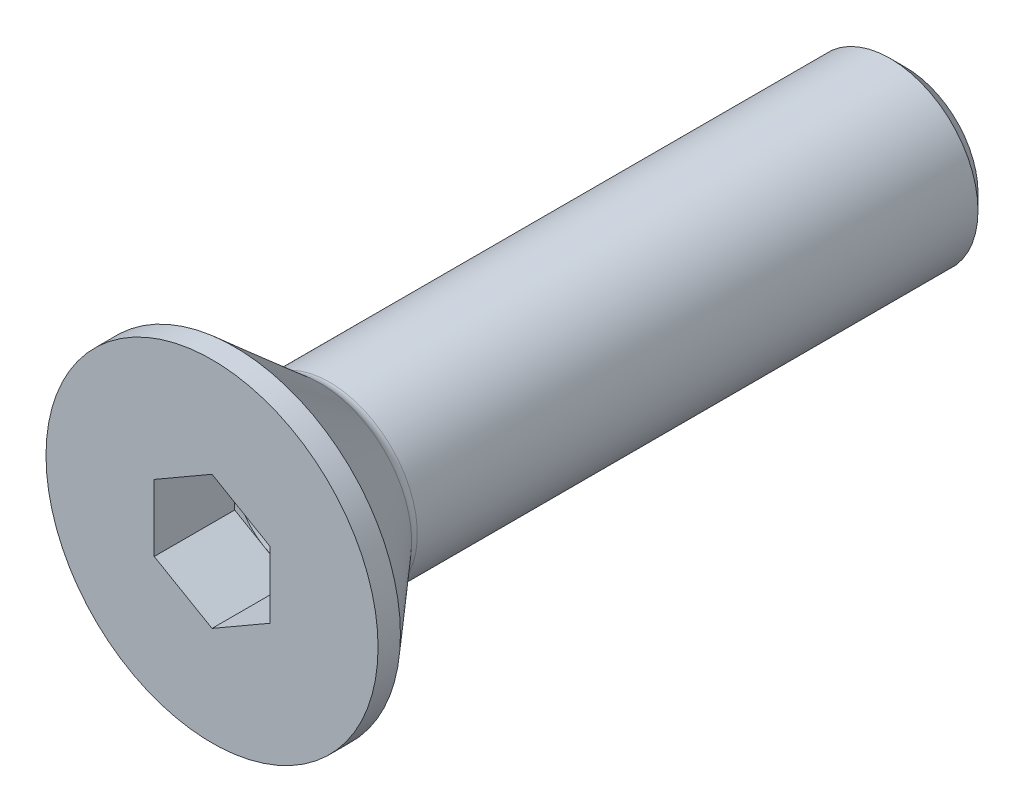
ISO-10303-21;
HEADER;
FILE_DESCRIPTION(('STEP AP214'),'2;1');
FILE_NAME('part.step','',(''),(''),'','','');
FILE_SCHEMA(('AUTOMOTIVE_DESIGN { 1 0 10303 214 1 1 1 1 }'));
ENDSEC;
DATA;
#1=APPLICATION_CONTEXT('core data for automotive mechanical design processes');
#2=APPLICATION_PROTOCOL_DEFINITION('international standard','automotive_design',2000,#1);
#3=PRODUCT_CONTEXT('',#1,'mechanical');
#4=PRODUCT('Part','Part','',(#3));
#5=PRODUCT_RELATED_PRODUCT_CATEGORY('part','',(#4));
#6=PRODUCT_DEFINITION_FORMATION('','',#4);
#7=PRODUCT_DEFINITION_CONTEXT('part definition',#1,'design');
#8=PRODUCT_DEFINITION('design','',#6,#7);
#9=PRODUCT_DEFINITION_SHAPE('','',#8);
#10=(LENGTH_UNIT() NAMED_UNIT(*) SI_UNIT(.MILLI.,.METRE.));
#11=(NAMED_UNIT(*) PLANE_ANGLE_UNIT() SI_UNIT($,.RADIAN.));
#12=(NAMED_UNIT(*) SI_UNIT($,.STERADIAN.) SOLID_ANGLE_UNIT());
#13=UNCERTAINTY_MEASURE_WITH_UNIT(LENGTH_MEASURE(1.E-05),#10,'distance_accuracy_value','');
#14=(GEOMETRIC_REPRESENTATION_CONTEXT(3) GLOBAL_UNCERTAINTY_ASSIGNED_CONTEXT((#13)) GLOBAL_UNIT_ASSIGNED_CONTEXT((#10,
#11,#12)) REPRESENTATION_CONTEXT('',''));
#15=CARTESIAN_POINT('',(0.,0.,0.));
#16=DIRECTION('',(0.,0.,1.));
#17=DIRECTION('',(1.,0.,0.));
#18=AXIS2_PLACEMENT_3D('',#15,#16,#17);
#19=CARTESIAN_POINT('',(0.,0.,-2.2098));
#20=DIRECTION('',(0.,0.,1.));
#21=DIRECTION('',(1.,0.,0.));
#22=AXIS2_PLACEMENT_3D('',#19,#20,#21);
#23=PLANE('',#22);
#24=CARTESIAN_POINT('',(0.,0.,-2.2098));
#25=DIRECTION('',(0.,0.,1.));
#26=DIRECTION('',(1.,0.,0.));
#27=AXIS2_PLACEMENT_3D('',#24,#25,#26);
#28=CIRCLE('',#27,1.5875);
#29=CARTESIAN_POINT('',(1.5875,0.,-2.2098));
#30=VERTEX_POINT('',#29);
#31=CARTESIAN_POINT('',(0.79375,1.3748153285078,-2.2098));
#32=VERTEX_POINT('',#31);
#33=EDGE_CURVE('E96',#30,#32,#28,.T.);
#34=ORIENTED_EDGE('',*,*,#33,.F.);
#35=DIRECTION('',(0.,-1.,0.));
#36=VECTOR('',#35,1.);
#37=CARTESIAN_POINT('',(1.5875,0.,-2.2098));
#38=LINE('',#37,#36);
#39=CARTESIAN_POINT('',(1.5875,0.916543552338531,-2.2098));
#40=VERTEX_POINT('',#39);
#41=EDGE_CURVE('E120',#40,#30,#38,.T.);
#42=ORIENTED_EDGE('',*,*,#41,.F.);
#43=DIRECTION('',(0.866025403784439,-0.5,0.));
#44=VECTOR('',#43,1.);
#45=CARTESIAN_POINT('',(1.82027223185862,0.782152441615088,-2.2098));
#46=LINE('',#45,#44);
#47=EDGE_CURVE('E118',#32,#40,#46,.T.);
#48=ORIENTED_EDGE('',*,*,#47,.F.);
#49=EDGE_LOOP('',(#34,#42,#48));
#50=FACE_BOUND('',#49,.T.);
#51=ADVANCED_FACE('F17',(#50),#23,.T.);
#52=CARTESIAN_POINT('',(-0.79375,1.3748153285078,-2.2098));
#53=VERTEX_POINT('',#52);
#54=EDGE_CURVE('E98',#32,#53,#28,.T.);
#55=ORIENTED_EDGE('',*,*,#54,.F.);
#56=CARTESIAN_POINT('',(0.,1.83308710467706,-2.2098));
#57=VERTEX_POINT('',#56);
#58=EDGE_CURVE('E113',#57,#32,#46,.T.);
#59=ORIENTED_EDGE('',*,*,#58,.F.);
#60=DIRECTION('',(0.866025403784438,0.5,0.));
#61=VECTOR('',#60,1.);
#62=CARTESIAN_POINT('',(-1.82027223185862,0.782152441615086,-2.2098));
#63=LINE('',#62,#61);
#64=EDGE_CURVE('E114',#53,#57,#63,.T.);
#65=ORIENTED_EDGE('',*,*,#64,.F.);
#66=EDGE_LOOP('',(#55,#59,#65));
#67=FACE_BOUND('',#66,.T.);
#68=ADVANCED_FACE('F111',(#67),#23,.T.);
#69=CARTESIAN_POINT('',(-1.5875,0.,-2.2098));
#70=VERTEX_POINT('',#69);
#71=EDGE_CURVE('E117',#53,#70,#28,.T.);
#72=ORIENTED_EDGE('',*,*,#71,.F.);
#73=CARTESIAN_POINT('',(-1.5875,0.916543552338531,-2.2098));
#74=VERTEX_POINT('',#73);
#75=EDGE_CURVE('E135',#74,#53,#63,.T.);
#76=ORIENTED_EDGE('',*,*,#75,.F.);
#77=DIRECTION('',(0.,1.,0.));
#78=VECTOR('',#77,1.);
#79=CARTESIAN_POINT('',(-1.5875,0.,-2.2098));
#80=LINE('',#79,#78);
#81=EDGE_CURVE('E139',#70,#74,#80,.T.);
#82=ORIENTED_EDGE('',*,*,#81,.F.);
#83=EDGE_LOOP('',(#72,#76,#82));
#84=FACE_BOUND('',#83,.T.);
#85=ADVANCED_FACE('F222',(#84),#23,.T.);
#86=CARTESIAN_POINT('',(-0.79375,-1.3748153285078,-2.2098));
#87=VERTEX_POINT('',#86);
#88=EDGE_CURVE('E247',#70,#87,#28,.T.);
#89=ORIENTED_EDGE('',*,*,#88,.F.);
#90=CARTESIAN_POINT('',(-1.5875,-0.91654355233853,-2.2098));
#91=VERTEX_POINT('',#90);
#92=EDGE_CURVE('E140',#91,#70,#80,.T.);
#93=ORIENTED_EDGE('',*,*,#92,.F.);
#94=DIRECTION('',(-0.866025403784439,0.5,0.));
#95=VECTOR('',#94,1.);
#96=CARTESIAN_POINT('',(0.232772231858619,-1.96747821540051,-2.2098));
#97=LINE('',#96,#95);
#98=EDGE_CURVE('E144',#87,#91,#97,.T.);
#99=ORIENTED_EDGE('',*,*,#98,.F.);
#100=EDGE_LOOP('',(#89,#93,#99));
#101=FACE_BOUND('',#100,.T.);
#102=ADVANCED_FACE('F234',(#101),#23,.T.);
#103=CARTESIAN_POINT('',(0.79375,-1.3748153285078,-2.2098));
#104=VERTEX_POINT('',#103);
#105=EDGE_CURVE('E33',#87,#104,#28,.T.);
#106=ORIENTED_EDGE('',*,*,#105,.F.);
#107=CARTESIAN_POINT('',(0.,-1.83308710467706,-2.2098));
#108=VERTEX_POINT('',#107);
#109=EDGE_CURVE('E145',#108,#87,#97,.T.);
#110=ORIENTED_EDGE('',*,*,#109,.F.);
#111=DIRECTION('',(-0.866025403784438,-0.5,0.));
#112=VECTOR('',#111,1.);
#113=CARTESIAN_POINT('',(1.82027223185862,-0.782152441615086,-2.2098));
#114=LINE('',#113,#112);
#115=EDGE_CURVE('E149',#104,#108,#114,.T.);
#116=ORIENTED_EDGE('',*,*,#115,.F.);
#117=EDGE_LOOP('',(#106,#110,#116));
#118=FACE_BOUND('',#117,.T.);
#119=ADVANCED_FACE('F227',(#118),#23,.T.);
#120=CARTESIAN_POINT('',(-2.27965,0.,0.));
#121=DIRECTION('',(0.,0.,-1.));
#122=DIRECTION('',(-1.,0.,0.));
#123=AXIS2_PLACEMENT_3D('',#120,#121,#122);
#124=PLANE('',#123);
#125=CARTESIAN_POINT('',(0.,0.,0.));
#126=DIRECTION('',(0.,0.,-1.));
#127=DIRECTION('',(-1.,0.,0.));
#128=AXIS2_PLACEMENT_3D('',#125,#126,#127);
#129=CIRCLE('',#128,4.5593);
#130=CARTESIAN_POINT('',(-4.5593,0.,0.));
#131=VERTEX_POINT('',#130);
#132=EDGE_CURVE('E204',#131,#131,#129,.T.);
#133=ORIENTED_EDGE('',*,*,#132,.F.);
#134=EDGE_LOOP('',(#133));
#135=FACE_BOUND('',#134,.T.);
#136=DIRECTION('',(0.866025403784439,-0.5,0.));
#137=VECTOR('',#136,1.);
#138=CARTESIAN_POINT('',(1.82027223185862,0.782152441615088,0.));
#139=LINE('',#138,#137);
#140=CARTESIAN_POINT('',(0.,1.83308710467706,0.));
#141=VERTEX_POINT('',#140);
#142=CARTESIAN_POINT('',(1.5875,0.916543552338531,0.));
#143=VERTEX_POINT('',#142);
#144=EDGE_CURVE('E106',#141,#143,#139,.T.);
#145=ORIENTED_EDGE('',*,*,#144,.T.);
#146=DIRECTION('',(0.,-1.,0.));
#147=VECTOR('',#146,1.);
#148=CARTESIAN_POINT('',(1.5875,0.,0.));
#149=LINE('',#148,#147);
#150=CARTESIAN_POINT('',(1.5875,-0.916543552338531,0.));
#151=VERTEX_POINT('',#150);
#152=EDGE_CURVE('E124',#143,#151,#149,.T.);
#153=ORIENTED_EDGE('',*,*,#152,.T.);
#154=DIRECTION('',(-0.866025403784438,-0.5,0.));
#155=VECTOR('',#154,1.);
#156=CARTESIAN_POINT('',(1.82027223185862,-0.782152441615086,0.));
#157=LINE('',#156,#155);
#158=CARTESIAN_POINT('',(0.,-1.83308710467706,0.));
#159=VERTEX_POINT('',#158);
#160=EDGE_CURVE('E41',#151,#159,#157,.T.);
#161=ORIENTED_EDGE('',*,*,#160,.T.);
#162=DIRECTION('',(-0.866025403784439,0.5,0.));
#163=VECTOR('',#162,1.);
#164=CARTESIAN_POINT('',(0.232772231858619,-1.96747821540051,0.));
#165=LINE('',#164,#163);
#166=CARTESIAN_POINT('',(-1.5875,-0.91654355233853,0.));
#167=VERTEX_POINT('',#166);
#168=EDGE_CURVE('E169',#159,#167,#165,.T.);
#169=ORIENTED_EDGE('',*,*,#168,.T.);
#170=DIRECTION('',(0.,1.,0.));
#171=VECTOR('',#170,1.);
#172=CARTESIAN_POINT('',(-1.5875,0.,0.));
#173=LINE('',#172,#171);
#174=CARTESIAN_POINT('',(-1.5875,0.916543552338531,0.));
#175=VERTEX_POINT('',#174);
#176=EDGE_CURVE('E165',#167,#175,#173,.T.);
#177=ORIENTED_EDGE('',*,*,#176,.T.);
#178=DIRECTION('',(0.866025403784438,0.5,0.));
#179=VECTOR('',#178,1.);
#180=CARTESIAN_POINT('',(-1.82027223185862,0.782152441615086,0.));
#181=LINE('',#180,#179);
#182=EDGE_CURVE('E161',#175,#141,#181,.T.);
#183=ORIENTED_EDGE('',*,*,#182,.T.);
#184=EDGE_LOOP('',(#145,#153,#161,#169,#177,#183));
#185=FACE_BOUND('',#184,.T.);
#186=ADVANCED_FACE('F233',(#135,#185),#124,.F.);
#187=CARTESIAN_POINT('',(0.,0.,3.39570524304279));
#188=DIRECTION('',(0.,0.,-1.));
#189=DIRECTION('',(-1.,0.,0.));
#190=AXIS2_PLACEMENT_3D('',#187,#188,#189);
#191=CYLINDRICAL_SURFACE('',#190,2.413);
#192=CARTESIAN_POINT('',(0.,0.,-18.62105761938));
#193=DIRECTION('',(0.,0.,1.));
#194=DIRECTION('',(1.,0.,0.));
#195=AXIS2_PLACEMENT_3D('',#192,#193,#194);
#196=CIRCLE('',#195,2.413);
#197=CARTESIAN_POINT('',(2.413,0.,-18.62105761938));
#198=VERTEX_POINT('',#197);
#199=EDGE_CURVE('E11',#198,#198,#196,.T.);
#200=ORIENTED_EDGE('',*,*,#199,.T.);
#201=EDGE_LOOP('',(#200));
#202=FACE_BOUND('',#201,.T.);
#203=CARTESIAN_POINT('',(0.,0.,-3.2258));
#204=DIRECTION('',(0.,0.,-1.));
#205=DIRECTION('',(-1.,0.,0.));
#206=AXIS2_PLACEMENT_3D('',#203,#204,#205);
#207=CIRCLE('',#206,2.413);
#208=CARTESIAN_POINT('',(-2.413,0.,-3.2258));
#209=VERTEX_POINT('',#208);
#210=EDGE_CURVE('E192',#209,#209,#207,.T.);
#211=ORIENTED_EDGE('',*,*,#210,.T.);
#212=EDGE_LOOP('',(#211));
#213=FACE_BOUND('',#212,.T.);
#214=ADVANCED_FACE('F239',(#202,#213),#191,.T.);
#215=CARTESIAN_POINT('',(-1.2065,0.,-19.05));
#216=DIRECTION('',(0.,0.,1.));
#217=DIRECTION('',(1.,0.,0.));
#218=AXIS2_PLACEMENT_3D('',#215,#216,#217);
#219=PLANE('',#218);
#220=CARTESIAN_POINT('',(0.,0.,-19.05));
#221=DIRECTION('',(0.,0.,1.));
#222=DIRECTION('',(1.,0.,0.));
#223=AXIS2_PLACEMENT_3D('',#220,#221,#222);
#224=CIRCLE('',#223,1.98405761938);
#225=CARTESIAN_POINT('',(1.98405761938,0.,-19.05));
#226=VERTEX_POINT('',#225);
#227=EDGE_CURVE('E26',#226,#226,#224,.F.);
#228=ORIENTED_EDGE('',*,*,#227,.T.);
#229=EDGE_LOOP('',(#228));
#230=FACE_BOUND('',#229,.T.);
#231=ADVANCED_FACE('F211',(#230),#219,.F.);
#232=CARTESIAN_POINT('',(0.,0.,3.39570524304279));
#233=DIRECTION('',(0.,0.,-1.));
#234=DIRECTION('',(-1.,0.,0.));
#235=AXIS2_PLACEMENT_3D('',#232,#233,#234);
#236=CYLINDRICAL_SURFACE('',#235,4.5593);
#237=CARTESIAN_POINT('',(0.,0.,-0.614314224697838));
#238=DIRECTION('',(0.,0.,-1.));
#239=DIRECTION('',(-1.,0.,0.));
#240=AXIS2_PLACEMENT_3D('',#237,#238,#239);
#241=CIRCLE('',#240,4.5593);
#242=CARTESIAN_POINT('',(-4.5593,0.,-0.614314224697838));
#243=VERTEX_POINT('',#242);
#244=EDGE_CURVE('E200',#243,#243,#241,.T.);
#245=ORIENTED_EDGE('',*,*,#244,.F.);
#246=EDGE_LOOP('',(#245));
#247=FACE_BOUND('',#246,.T.);
#248=ORIENTED_EDGE('',*,*,#132,.T.);
#249=EDGE_LOOP('',(#248));
#250=FACE_BOUND('',#249,.T.);
#251=ADVANCED_FACE('F314',(#247,#250),#236,.T.);
#252=CARTESIAN_POINT('',(0.,0.,-0.614314224697838));
#253=DIRECTION('',(0.,0.,1.));
#254=DIRECTION('',(1.,0.,0.));
#255=AXIS2_PLACEMENT_3D('',#252,#253,#254);
#256=CONICAL_SURFACE('',#255,4.5593,0.715584993317675);
#257=CARTESIAN_POINT('',(0.,0.,-2.97584150995462));
#258=DIRECTION('',(0.,0.,-1.));
#259=DIRECTION('',(-1.,0.,0.));
#260=AXIS2_PLACEMENT_3D('',#257,#258,#259);
#261=CIRCLE('',#260,2.50645564993513);
#262=CARTESIAN_POINT('',(-2.50645564993513,0.,-2.97584150995462));
#263=VERTEX_POINT('',#262);
#264=EDGE_CURVE('E196',#263,#263,#261,.T.);
#265=ORIENTED_EDGE('',*,*,#264,.F.);
#266=EDGE_LOOP('',(#265));
#267=FACE_BOUND('',#266,.T.);
#268=ORIENTED_EDGE('',*,*,#244,.T.);
#269=EDGE_LOOP('',(#268));
#270=FACE_BOUND('',#269,.T.);
#271=ADVANCED_FACE('F322',(#267,#270),#256,.T.);
#272=CARTESIAN_POINT('',(0.,0.,-3.2258));
#273=DIRECTION('',(0.,0.,-1.));
#274=DIRECTION('',(-1.,0.,0.));
#275=AXIS2_PLACEMENT_3D('',#272,#273,#274);
#276=TOROIDAL_SURFACE('',#275,2.794,0.381);
#277=ORIENTED_EDGE('',*,*,#264,.T.);
#278=EDGE_LOOP('',(#277));
#279=FACE_BOUND('',#278,.T.);
#280=ORIENTED_EDGE('',*,*,#210,.F.);
#281=EDGE_LOOP('',(#280));
#282=FACE_BOUND('',#281,.T.);
#283=ADVANCED_FACE('F331',(#279,#282),#276,.F.);
#284=CARTESIAN_POINT('',(1.82027223185862,0.782152441615088,-2.2098));
#285=DIRECTION('',(-0.5,-0.866025403784439,0.));
#286=DIRECTION('',(0.866025403784439,-0.5,0.));
#287=AXIS2_PLACEMENT_3D('',#284,#285,#286);
#288=PLANE('',#287);
#289=ORIENTED_EDGE('',*,*,#144,.F.);
#290=DIRECTION('',(0.,0.,1.));
#291=VECTOR('',#290,1.);
#292=CARTESIAN_POINT('',(0.,1.83308710467706,-2.2098));
#293=LINE('',#292,#291);
#294=EDGE_CURVE('E129',#57,#141,#293,.T.);
#295=ORIENTED_EDGE('',*,*,#294,.F.);
#296=ORIENTED_EDGE('',*,*,#58,.T.);
#297=ORIENTED_EDGE('',*,*,#47,.T.);
#298=DIRECTION('',(0.,0.,1.));
#299=VECTOR('',#298,1.);
#300=CARTESIAN_POINT('',(1.5875,0.916543552338531,-2.2098));
#301=LINE('',#300,#299);
#302=EDGE_CURVE('E157',#40,#143,#301,.T.);
#303=ORIENTED_EDGE('',*,*,#302,.T.);
#304=EDGE_LOOP('',(#289,#295,#296,#297,#303));
#305=FACE_BOUND('',#304,.T.);
#306=ADVANCED_FACE('F128',(#305),#288,.T.);
#307=CARTESIAN_POINT('',(-1.82027223185862,0.782152441615086,-2.2098));
#308=DIRECTION('',(0.5,-0.866025403784438,0.));
#309=DIRECTION('',(0.866025403784439,0.5,0.));
#310=AXIS2_PLACEMENT_3D('',#307,#308,#309);
#311=PLANE('',#310);
#312=ORIENTED_EDGE('',*,*,#182,.F.);
#313=DIRECTION('',(0.,0.,1.));
#314=VECTOR('',#313,1.);
#315=CARTESIAN_POINT('',(-1.5875,0.916543552338531,-2.2098));
#316=LINE('',#315,#314);
#317=EDGE_CURVE('E188',#74,#175,#316,.T.);
#318=ORIENTED_EDGE('',*,*,#317,.F.);
#319=ORIENTED_EDGE('',*,*,#75,.T.);
#320=ORIENTED_EDGE('',*,*,#64,.T.);
#321=ORIENTED_EDGE('',*,*,#294,.T.);
#322=EDGE_LOOP('',(#312,#318,#319,#320,#321));
#323=FACE_BOUND('',#322,.T.);
#324=ADVANCED_FACE('F270',(#323),#311,.T.);
#325=CARTESIAN_POINT('',(-1.5875,0.,-2.2098));
#326=DIRECTION('',(1.,0.,0.));
#327=DIRECTION('',(0.,0.,-1.));
#328=AXIS2_PLACEMENT_3D('',#325,#326,#327);
#329=PLANE('',#328);
#330=ORIENTED_EDGE('',*,*,#176,.F.);
#331=DIRECTION('',(0.,0.,1.));
#332=VECTOR('',#331,1.);
#333=CARTESIAN_POINT('',(-1.5875,-0.91654355233853,-2.2098));
#334=LINE('',#333,#332);
#335=EDGE_CURVE('E185',#91,#167,#334,.T.);
#336=ORIENTED_EDGE('',*,*,#335,.F.);
#337=ORIENTED_EDGE('',*,*,#92,.T.);
#338=ORIENTED_EDGE('',*,*,#81,.T.);
#339=ORIENTED_EDGE('',*,*,#317,.T.);
#340=EDGE_LOOP('',(#330,#336,#337,#338,#339));
#341=FACE_BOUND('',#340,.T.);
#342=ADVANCED_FACE('F265',(#341),#329,.T.);
#343=CARTESIAN_POINT('',(0.232772231858619,-1.96747821540051,-2.2098));
#344=DIRECTION('',(0.5,0.866025403784439,0.));
#345=DIRECTION('',(-0.866025403784439,0.5,0.));
#346=AXIS2_PLACEMENT_3D('',#343,#344,#345);
#347=PLANE('',#346);
#348=ORIENTED_EDGE('',*,*,#168,.F.);
#349=DIRECTION('',(0.,0.,1.));
#350=VECTOR('',#349,1.);
#351=CARTESIAN_POINT('',(0.,-1.83308710467706,-2.2098));
#352=LINE('',#351,#350);
#353=EDGE_CURVE('E183',#108,#159,#352,.T.);
#354=ORIENTED_EDGE('',*,*,#353,.F.);
#355=ORIENTED_EDGE('',*,*,#109,.T.);
#356=ORIENTED_EDGE('',*,*,#98,.T.);
#357=ORIENTED_EDGE('',*,*,#335,.T.);
#358=EDGE_LOOP('',(#348,#354,#355,#356,#357));
#359=FACE_BOUND('',#358,.T.);
#360=ADVANCED_FACE('F256',(#359),#347,.T.);
#361=CARTESIAN_POINT('',(1.82027223185862,-0.782152441615086,-2.2098));
#362=DIRECTION('',(-0.5,0.866025403784438,0.));
#363=DIRECTION('',(-0.866025403784438,-0.5,0.));
#364=AXIS2_PLACEMENT_3D('',#361,#362,#363);
#365=PLANE('',#364);
#366=ORIENTED_EDGE('',*,*,#160,.F.);
#367=DIRECTION('',(0.,0.,1.));
#368=VECTOR('',#367,1.);
#369=CARTESIAN_POINT('',(1.5875,-0.916543552338531,-2.2098));
#370=LINE('',#369,#368);
#371=CARTESIAN_POINT('',(1.5875,-0.916543552338531,-2.2098));
#372=VERTEX_POINT('',#371);
#373=EDGE_CURVE('E180',#372,#151,#370,.T.);
#374=ORIENTED_EDGE('',*,*,#373,.F.);
#375=EDGE_CURVE('E150',#372,#104,#114,.T.);
#376=ORIENTED_EDGE('',*,*,#375,.T.);
#377=ORIENTED_EDGE('',*,*,#115,.T.);
#378=ORIENTED_EDGE('',*,*,#353,.T.);
#379=EDGE_LOOP('',(#366,#374,#376,#377,#378));
#380=FACE_BOUND('',#379,.T.);
#381=ADVANCED_FACE('F230',(#380),#365,.T.);
#382=CARTESIAN_POINT('',(1.5875,0.,-2.2098));
#383=DIRECTION('',(-1.,0.,0.));
#384=DIRECTION('',(0.,0.,1.));
#385=AXIS2_PLACEMENT_3D('',#382,#383,#384);
#386=PLANE('',#385);
#387=ORIENTED_EDGE('',*,*,#152,.F.);
#388=ORIENTED_EDGE('',*,*,#302,.F.);
#389=ORIENTED_EDGE('',*,*,#41,.T.);
#390=EDGE_CURVE('E154',#30,#372,#38,.T.);
#391=ORIENTED_EDGE('',*,*,#390,.T.);
#392=ORIENTED_EDGE('',*,*,#373,.T.);
#393=EDGE_LOOP('',(#387,#388,#389,#391,#392));
#394=FACE_BOUND('',#393,.T.);
#395=ADVANCED_FACE('F225',(#394),#386,.T.);
#396=EDGE_CURVE('E100',#104,#30,#28,.T.);
#397=ORIENTED_EDGE('',*,*,#396,.F.);
#398=ORIENTED_EDGE('',*,*,#375,.F.);
#399=ORIENTED_EDGE('',*,*,#390,.F.);
#400=EDGE_LOOP('',(#397,#398,#399));
#401=FACE_BOUND('',#400,.T.);
#402=ADVANCED_FACE('F93',(#401),#23,.T.);
#403=CARTESIAN_POINT('',(0.,0.,-2.2098));
#404=DIRECTION('',(0.,0.,1.));
#405=DIRECTION('',(1.,0.,0.));
#406=AXIS2_PLACEMENT_3D('',#403,#404,#405);
#407=CONICAL_SURFACE('',#406,1.5875,1.22173047639603);
#408=CARTESIAN_POINT('',(0.,0.,-2.7876027468976));
#409=VERTEX_POINT('',#408);
#410=VERTEX_LOOP('',#409);
#411=FACE_BOUND('',#410,.T.);
#412=ORIENTED_EDGE('',*,*,#33,.T.);
#413=ORIENTED_EDGE('',*,*,#54,.T.);
#414=ORIENTED_EDGE('',*,*,#71,.T.);
#415=ORIENTED_EDGE('',*,*,#88,.T.);
#416=ORIENTED_EDGE('',*,*,#105,.T.);
#417=ORIENTED_EDGE('',*,*,#396,.T.);
#418=EDGE_LOOP('',(#412,#413,#414,#415,#416,#417));
#419=FACE_BOUND('',#418,.T.);
#420=ADVANCED_FACE('F91',(#411,#419),#407,.F.);
#421=CARTESIAN_POINT('',(0.,0.,-19.05));
#422=DIRECTION('',(0.,0.,1.));
#423=DIRECTION('',(1.,0.,0.));
#424=AXIS2_PLACEMENT_3D('',#421,#422,#423);
#425=CONICAL_SURFACE('',#424,1.98405761938,0.785398163397449);
#426=ORIENTED_EDGE('',*,*,#199,.F.);
#427=EDGE_LOOP('',(#426));
#428=FACE_BOUND('',#427,.T.);
#429=ORIENTED_EDGE('',*,*,#227,.F.);
#430=EDGE_LOOP('',(#429));
#431=FACE_BOUND('',#430,.T.);
#432=ADVANCED_FACE('F19',(#428,#431),#425,.T.);
#433=CLOSED_SHELL('',(#51,#68,#85,#102,#119,#186,#214,#231,#251,#271,#283,#306,#324,#342,#360,
#381,#395,#402,#420,#432));
#434=MANIFOLD_SOLID_BREP('B1',#433);
#435=ADVANCED_BREP_SHAPE_REPRESENTATION('',(#18,#434),#14);
#436=SHAPE_DEFINITION_REPRESENTATION(#9,#435);
ENDSEC;
END-ISO-10303-21;
